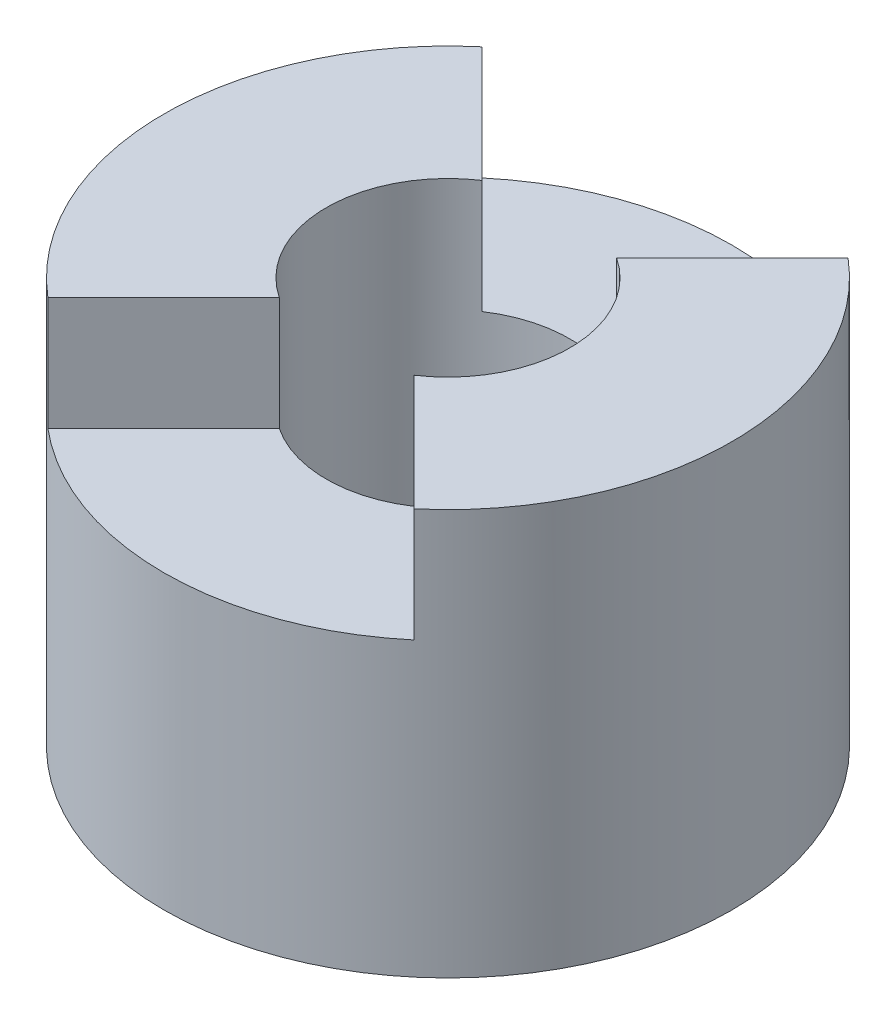
ISO-10303-21;
HEADER;
FILE_DESCRIPTION(('STEP AP214'),'2;1');
FILE_NAME('part.step','',(''),(''),'','','');
FILE_SCHEMA(('AUTOMOTIVE_DESIGN { 1 0 10303 214 1 1 1 1 }'));
ENDSEC;
DATA;
#1=APPLICATION_CONTEXT('core data for automotive mechanical design processes');
#2=APPLICATION_PROTOCOL_DEFINITION('international standard','automotive_design',2000,#1);
#3=PRODUCT_CONTEXT('',#1,'mechanical');
#4=PRODUCT('Part','Part','',(#3));
#5=PRODUCT_RELATED_PRODUCT_CATEGORY('part','',(#4));
#6=PRODUCT_DEFINITION_FORMATION('','',#4);
#7=PRODUCT_DEFINITION_CONTEXT('part definition',#1,'design');
#8=PRODUCT_DEFINITION('design','',#6,#7);
#9=PRODUCT_DEFINITION_SHAPE('','',#8);
#10=(LENGTH_UNIT() NAMED_UNIT(*) SI_UNIT(.MILLI.,.METRE.));
#11=(NAMED_UNIT(*) PLANE_ANGLE_UNIT() SI_UNIT($,.RADIAN.));
#12=(NAMED_UNIT(*) SI_UNIT($,.STERADIAN.) SOLID_ANGLE_UNIT());
#13=UNCERTAINTY_MEASURE_WITH_UNIT(LENGTH_MEASURE(1.E-05),#10,'distance_accuracy_value','');
#14=(GEOMETRIC_REPRESENTATION_CONTEXT(3) GLOBAL_UNCERTAINTY_ASSIGNED_CONTEXT((#13)) GLOBAL_UNIT_ASSIGNED_CONTEXT((#10,
#11,#12)) REPRESENTATION_CONTEXT('',''));
#15=CARTESIAN_POINT('',(0.,0.,0.));
#16=DIRECTION('',(0.,0.,1.));
#17=DIRECTION('',(1.,0.,0.));
#18=AXIS2_PLACEMENT_3D('',#15,#16,#17);
#19=CARTESIAN_POINT('',(0.,50.,0.));
#20=DIRECTION('',(0.,1.,0.));
#21=DIRECTION('',(0.,0.,1.));
#22=AXIS2_PLACEMENT_3D('',#19,#20,#21);
#23=PLANE('',#22);
#24=CARTESIAN_POINT('',(0.,50.,0.));
#25=DIRECTION('',(0.,1.,0.));
#26=DIRECTION('',(0.,0.,1.));
#27=AXIS2_PLACEMENT_3D('',#24,#25,#26);
#28=CIRCLE('',#27,15.);
#29=CARTESIAN_POINT('',(-8.2915619758885,50.,-12.5));
#30=VERTEX_POINT('',#29);
#31=CARTESIAN_POINT('',(-8.2915619758885,50.,12.5));
#32=VERTEX_POINT('',#31);
#33=EDGE_CURVE('E119',#30,#32,#28,.T.);
#34=ORIENTED_EDGE('',*,*,#33,.F.);
#35=DIRECTION('',(-0.707106781186547,0.,-0.707106781186548));
#36=VECTOR('',#35,1.);
#37=CARTESIAN_POINT('',(-8.2915619758885,50.,-12.5));
#38=LINE('',#37,#36);
#39=CARTESIAN_POINT('',(-22.5549022689085,50.,-26.76334029302));
#40=VERTEX_POINT('',#39);
#41=EDGE_CURVE('E107',#30,#40,#38,.T.);
#42=ORIENTED_EDGE('',*,*,#41,.T.);
#43=CARTESIAN_POINT('',(0.,50.,0.));
#44=DIRECTION('',(0.,1.,0.));
#45=DIRECTION('',(0.,0.,1.));
#46=AXIS2_PLACEMENT_3D('',#43,#44,#45);
#47=CIRCLE('',#46,35.);
#48=CARTESIAN_POINT('',(-22.5549022689085,50.,26.76334029302));
#49=VERTEX_POINT('',#48);
#50=EDGE_CURVE('E46',#40,#49,#47,.T.);
#51=ORIENTED_EDGE('',*,*,#50,.T.);
#52=DIRECTION('',(-0.707106781186547,0.,0.707106781186548));
#53=VECTOR('',#52,1.);
#54=CARTESIAN_POINT('',(-8.2915619758885,50.,12.5));
#55=LINE('',#54,#53);
#56=EDGE_CURVE('E138',#32,#49,#55,.T.);
#57=ORIENTED_EDGE('',*,*,#56,.F.);
#58=EDGE_LOOP('',(#34,#42,#51,#57));
#59=FACE_BOUND('',#58,.T.);
#60=ADVANCED_FACE('F37',(#59),#23,.T.);
#61=CARTESIAN_POINT('',(22.5549022689085,50.,26.76334029302));
#62=VERTEX_POINT('',#61);
#63=CARTESIAN_POINT('',(22.5549022689085,50.,-26.76334029302));
#64=VERTEX_POINT('',#63);
#65=EDGE_CURVE('E12',#62,#64,#47,.T.);
#66=ORIENTED_EDGE('',*,*,#65,.T.);
#67=DIRECTION('',(-0.707106781186547,0.,0.707106781186548));
#68=VECTOR('',#67,1.);
#69=CARTESIAN_POINT('',(8.2915619758885,50.,-12.5));
#70=LINE('',#69,#68);
#71=CARTESIAN_POINT('',(8.2915619758885,50.,-12.5));
#72=VERTEX_POINT('',#71);
#73=EDGE_CURVE('E113',#64,#72,#70,.T.);
#74=ORIENTED_EDGE('',*,*,#73,.T.);
#75=CARTESIAN_POINT('',(8.2915619758885,50.,12.5));
#76=VERTEX_POINT('',#75);
#77=EDGE_CURVE('E126',#76,#72,#28,.T.);
#78=ORIENTED_EDGE('',*,*,#77,.F.);
#79=DIRECTION('',(-0.707106781186547,0.,-0.707106781186548));
#80=VECTOR('',#79,1.);
#81=CARTESIAN_POINT('',(8.2915619758885,50.,12.5));
#82=LINE('',#81,#80);
#83=EDGE_CURVE('E147',#62,#76,#82,.T.);
#84=ORIENTED_EDGE('',*,*,#83,.F.);
#85=EDGE_LOOP('',(#66,#74,#78,#84));
#86=FACE_BOUND('',#85,.T.);
#87=ADVANCED_FACE('F178',(#86),#23,.T.);
#88=CARTESIAN_POINT('',(0.,50.,0.));
#89=DIRECTION('',(0.,-1.,0.));
#90=DIRECTION('',(0.,0.,-1.));
#91=AXIS2_PLACEMENT_3D('',#88,#89,#90);
#92=CYLINDRICAL_SURFACE('',#91,35.);
#93=CARTESIAN_POINT('',(0.,0.,0.));
#94=DIRECTION('',(0.,1.,0.));
#95=DIRECTION('',(0.,0.,1.));
#96=AXIS2_PLACEMENT_3D('',#93,#94,#95);
#97=CIRCLE('',#96,35.);
#98=CARTESIAN_POINT('',(0.,0.,35.));
#99=VERTEX_POINT('',#98);
#100=EDGE_CURVE('E41',#99,#99,#97,.T.);
#101=ORIENTED_EDGE('',*,*,#100,.T.);
#102=EDGE_LOOP('',(#101));
#103=FACE_BOUND('',#102,.T.);
#104=DIRECTION('',(0.,1.,0.));
#105=VECTOR('',#104,1.);
#106=CARTESIAN_POINT('',(-22.5549022689085,-50.4097655761267,-26.76334029302));
#107=LINE('',#106,#105);
#108=CARTESIAN_POINT('',(-22.5549022689085,36.,-26.76334029302));
#109=VERTEX_POINT('',#108);
#110=EDGE_CURVE('E104',#109,#40,#107,.T.);
#111=ORIENTED_EDGE('',*,*,#110,.F.);
#112=CARTESIAN_POINT('',(0.,36.,0.));
#113=DIRECTION('',(0.,1.,0.));
#114=DIRECTION('',(0.,0.,1.));
#115=AXIS2_PLACEMENT_3D('',#112,#113,#114);
#116=CIRCLE('',#115,35.);
#117=CARTESIAN_POINT('',(22.5549022689085,36.,-26.76334029302));
#118=VERTEX_POINT('',#117);
#119=EDGE_CURVE('E149',#118,#109,#116,.T.);
#120=ORIENTED_EDGE('',*,*,#119,.F.);
#121=DIRECTION('',(0.,1.,0.));
#122=VECTOR('',#121,1.);
#123=CARTESIAN_POINT('',(22.5549022689085,-50.4097655761267,-26.76334029302));
#124=LINE('',#123,#122);
#125=EDGE_CURVE('E156',#118,#64,#124,.T.);
#126=ORIENTED_EDGE('',*,*,#125,.T.);
#127=ORIENTED_EDGE('',*,*,#65,.F.);
#128=DIRECTION('',(0.,1.,0.));
#129=VECTOR('',#128,1.);
#130=CARTESIAN_POINT('',(22.5549022689085,-50.4097655761267,26.76334029302));
#131=LINE('',#130,#129);
#132=CARTESIAN_POINT('',(22.5549022689085,36.,26.76334029302));
#133=VERTEX_POINT('',#132);
#134=EDGE_CURVE('E135',#133,#62,#131,.T.);
#135=ORIENTED_EDGE('',*,*,#134,.F.);
#136=CARTESIAN_POINT('',(0.,36.,0.));
#137=DIRECTION('',(0.,1.,0.));
#138=DIRECTION('',(0.,0.,1.));
#139=AXIS2_PLACEMENT_3D('',#136,#137,#138);
#140=CIRCLE('',#139,35.);
#141=CARTESIAN_POINT('',(-22.5549022689085,36.,26.76334029302));
#142=VERTEX_POINT('',#141);
#143=EDGE_CURVE('E134',#133,#142,#140,.F.);
#144=ORIENTED_EDGE('',*,*,#143,.T.);
#145=DIRECTION('',(0.,1.,0.));
#146=VECTOR('',#145,1.);
#147=CARTESIAN_POINT('',(-22.5549022689085,-50.4097655761267,26.76334029302));
#148=LINE('',#147,#146);
#149=EDGE_CURVE('E124',#142,#49,#148,.T.);
#150=ORIENTED_EDGE('',*,*,#149,.T.);
#151=ORIENTED_EDGE('',*,*,#50,.F.);
#152=EDGE_LOOP('',(#111,#120,#126,#127,#135,#144,#150,#151));
#153=FACE_BOUND('',#152,.T.);
#154=ADVANCED_FACE('F39',(#103,#153),#92,.T.);
#155=CARTESIAN_POINT('',(0.,50.,0.));
#156=DIRECTION('',(0.,-1.,0.));
#157=DIRECTION('',(0.,0.,-1.));
#158=AXIS2_PLACEMENT_3D('',#155,#156,#157);
#159=CYLINDRICAL_SURFACE('',#158,15.);
#160=CARTESIAN_POINT('',(0.,0.,0.));
#161=DIRECTION('',(0.,1.,0.));
#162=DIRECTION('',(0.,0.,1.));
#163=AXIS2_PLACEMENT_3D('',#160,#161,#162);
#164=CIRCLE('',#163,15.);
#165=CARTESIAN_POINT('',(0.,0.,15.));
#166=VERTEX_POINT('',#165);
#167=EDGE_CURVE('E128',#166,#166,#164,.T.);
#168=ORIENTED_EDGE('',*,*,#167,.F.);
#169=EDGE_LOOP('',(#168));
#170=FACE_BOUND('',#169,.T.);
#171=CARTESIAN_POINT('',(0.,36.,0.));
#172=DIRECTION('',(0.,1.,0.));
#173=DIRECTION('',(0.,0.,1.));
#174=AXIS2_PLACEMENT_3D('',#171,#172,#173);
#175=CIRCLE('',#174,15.);
#176=CARTESIAN_POINT('',(-8.2915619758885,36.,-12.5));
#177=VERTEX_POINT('',#176);
#178=CARTESIAN_POINT('',(8.2915619758885,36.,-12.5));
#179=VERTEX_POINT('',#178);
#180=EDGE_CURVE('E155',#177,#179,#175,.F.);
#181=ORIENTED_EDGE('',*,*,#180,.F.);
#182=DIRECTION('',(0.,1.,0.));
#183=VECTOR('',#182,1.);
#184=CARTESIAN_POINT('',(-8.2915619758885,-50.4097655761267,-12.5));
#185=LINE('',#184,#183);
#186=EDGE_CURVE('E112',#177,#30,#185,.T.);
#187=ORIENTED_EDGE('',*,*,#186,.T.);
#188=ORIENTED_EDGE('',*,*,#33,.T.);
#189=DIRECTION('',(0.,1.,0.));
#190=VECTOR('',#189,1.);
#191=CARTESIAN_POINT('',(-8.2915619758885,-50.4097655761267,12.5));
#192=LINE('',#191,#190);
#193=CARTESIAN_POINT('',(-8.2915619758885,36.,12.5));
#194=VERTEX_POINT('',#193);
#195=EDGE_CURVE('E141',#194,#32,#192,.T.);
#196=ORIENTED_EDGE('',*,*,#195,.F.);
#197=CARTESIAN_POINT('',(0.,36.,0.));
#198=DIRECTION('',(0.,1.,0.));
#199=DIRECTION('',(0.,0.,1.));
#200=AXIS2_PLACEMENT_3D('',#197,#198,#199);
#201=CIRCLE('',#200,15.);
#202=CARTESIAN_POINT('',(8.2915619758885,36.,12.5));
#203=VERTEX_POINT('',#202);
#204=EDGE_CURVE('E145',#194,#203,#201,.T.);
#205=ORIENTED_EDGE('',*,*,#204,.T.);
#206=DIRECTION('',(0.,1.,0.));
#207=VECTOR('',#206,1.);
#208=CARTESIAN_POINT('',(8.2915619758885,-50.4097655761267,12.5));
#209=LINE('',#208,#207);
#210=EDGE_CURVE('E137',#203,#76,#209,.T.);
#211=ORIENTED_EDGE('',*,*,#210,.T.);
#212=ORIENTED_EDGE('',*,*,#77,.T.);
#213=DIRECTION('',(0.,1.,0.));
#214=VECTOR('',#213,1.);
#215=CARTESIAN_POINT('',(8.2915619758885,-50.4097655761267,-12.5));
#216=LINE('',#215,#214);
#217=EDGE_CURVE('E159',#179,#72,#216,.T.);
#218=ORIENTED_EDGE('',*,*,#217,.F.);
#219=EDGE_LOOP('',(#181,#187,#188,#196,#205,#211,#212,#218));
#220=FACE_BOUND('',#219,.T.);
#221=ADVANCED_FACE('F173',(#170,#220),#159,.F.);
#222=CARTESIAN_POINT('',(0.,0.,0.));
#223=DIRECTION('',(0.,1.,0.));
#224=DIRECTION('',(0.,0.,1.));
#225=AXIS2_PLACEMENT_3D('',#222,#223,#224);
#226=PLANE('',#225);
#227=ORIENTED_EDGE('',*,*,#100,.F.);
#228=EDGE_LOOP('',(#227));
#229=FACE_BOUND('',#228,.T.);
#230=ORIENTED_EDGE('',*,*,#167,.T.);
#231=EDGE_LOOP('',(#230));
#232=FACE_BOUND('',#231,.T.);
#233=ADVANCED_FACE('F189',(#229,#232),#226,.F.);
#234=CARTESIAN_POINT('',(-8.2915619758885,-50.4097655761267,12.5));
#235=DIRECTION('',(-0.707106781186548,0.,-0.707106781186547));
#236=DIRECTION('',(-0.707106781186547,0.,0.707106781186548));
#237=AXIS2_PLACEMENT_3D('',#234,#235,#236);
#238=PLANE('',#237);
#239=DIRECTION('',(0.707106781186547,0.,-0.707106781186548));
#240=VECTOR('',#239,1.);
#241=CARTESIAN_POINT('',(-8.2915619758885,36.,12.5));
#242=LINE('',#241,#240);
#243=EDGE_CURVE('E151',#142,#194,#242,.T.);
#244=ORIENTED_EDGE('',*,*,#243,.T.);
#245=ORIENTED_EDGE('',*,*,#195,.T.);
#246=ORIENTED_EDGE('',*,*,#56,.T.);
#247=ORIENTED_EDGE('',*,*,#149,.F.);
#248=EDGE_LOOP('',(#244,#245,#246,#247));
#249=FACE_BOUND('',#248,.T.);
#250=ADVANCED_FACE('F187',(#249),#238,.F.);
#251=CARTESIAN_POINT('',(8.2915619758885,-50.4097655761267,12.5));
#252=DIRECTION('',(0.707106781186548,0.,-0.707106781186547));
#253=DIRECTION('',(-0.707106781186547,0.,-0.707106781186548));
#254=AXIS2_PLACEMENT_3D('',#251,#252,#253);
#255=PLANE('',#254);
#256=DIRECTION('',(0.707106781186547,0.,0.707106781186548));
#257=VECTOR('',#256,1.);
#258=CARTESIAN_POINT('',(8.2915619758885,36.,12.5));
#259=LINE('',#258,#257);
#260=EDGE_CURVE('E61',#203,#133,#259,.T.);
#261=ORIENTED_EDGE('',*,*,#260,.T.);
#262=ORIENTED_EDGE('',*,*,#134,.T.);
#263=ORIENTED_EDGE('',*,*,#83,.T.);
#264=ORIENTED_EDGE('',*,*,#210,.F.);
#265=EDGE_LOOP('',(#261,#262,#263,#264));
#266=FACE_BOUND('',#265,.T.);
#267=ADVANCED_FACE('F183',(#266),#255,.F.);
#268=CARTESIAN_POINT('',(0.,36.,0.));
#269=DIRECTION('',(0.,1.,0.));
#270=DIRECTION('',(0.,0.,1.));
#271=AXIS2_PLACEMENT_3D('',#268,#269,#270);
#272=PLANE('',#271);
#273=ORIENTED_EDGE('',*,*,#143,.F.);
#274=ORIENTED_EDGE('',*,*,#260,.F.);
#275=ORIENTED_EDGE('',*,*,#204,.F.);
#276=ORIENTED_EDGE('',*,*,#243,.F.);
#277=EDGE_LOOP('',(#273,#274,#275,#276));
#278=FACE_BOUND('',#277,.T.);
#279=ADVANCED_FACE('F184',(#278),#272,.T.);
#280=CARTESIAN_POINT('',(-8.2915619758885,-50.4097655761267,-12.5));
#281=DIRECTION('',(0.707106781186548,0.,-0.707106781186547));
#282=DIRECTION('',(-0.707106781186547,0.,-0.707106781186548));
#283=AXIS2_PLACEMENT_3D('',#280,#281,#282);
#284=PLANE('',#283);
#285=ORIENTED_EDGE('',*,*,#110,.T.);
#286=ORIENTED_EDGE('',*,*,#41,.F.);
#287=ORIENTED_EDGE('',*,*,#186,.F.);
#288=DIRECTION('',(0.707106781186547,0.,0.707106781186548));
#289=VECTOR('',#288,1.);
#290=CARTESIAN_POINT('',(-8.2915619758885,36.,-12.5));
#291=LINE('',#290,#289);
#292=EDGE_CURVE('E53',#109,#177,#291,.T.);
#293=ORIENTED_EDGE('',*,*,#292,.F.);
#294=EDGE_LOOP('',(#285,#286,#287,#293));
#295=FACE_BOUND('',#294,.T.);
#296=ADVANCED_FACE('F106',(#295),#284,.T.);
#297=CARTESIAN_POINT('',(8.2915619758885,-50.4097655761267,-12.5));
#298=DIRECTION('',(-0.707106781186548,0.,-0.707106781186547));
#299=DIRECTION('',(-0.707106781186547,0.,0.707106781186548));
#300=AXIS2_PLACEMENT_3D('',#297,#298,#299);
#301=PLANE('',#300);
#302=ORIENTED_EDGE('',*,*,#217,.T.);
#303=ORIENTED_EDGE('',*,*,#73,.F.);
#304=ORIENTED_EDGE('',*,*,#125,.F.);
#305=DIRECTION('',(0.707106781186547,0.,-0.707106781186548));
#306=VECTOR('',#305,1.);
#307=CARTESIAN_POINT('',(8.2915619758885,36.,-12.5));
#308=LINE('',#307,#306);
#309=EDGE_CURVE('E166',#179,#118,#308,.T.);
#310=ORIENTED_EDGE('',*,*,#309,.F.);
#311=EDGE_LOOP('',(#302,#303,#304,#310));
#312=FACE_BOUND('',#311,.T.);
#313=ADVANCED_FACE('F176',(#312),#301,.T.);
#314=CARTESIAN_POINT('',(0.,36.,0.));
#315=DIRECTION('',(0.,1.,0.));
#316=DIRECTION('',(0.,0.,1.));
#317=AXIS2_PLACEMENT_3D('',#314,#315,#316);
#318=PLANE('',#317);
#319=ORIENTED_EDGE('',*,*,#309,.T.);
#320=ORIENTED_EDGE('',*,*,#119,.T.);
#321=ORIENTED_EDGE('',*,*,#292,.T.);
#322=ORIENTED_EDGE('',*,*,#180,.T.);
#323=EDGE_LOOP('',(#319,#320,#321,#322));
#324=FACE_BOUND('',#323,.T.);
#325=ADVANCED_FACE('F171',(#324),#318,.T.);
#326=CLOSED_SHELL('',(#60,#87,#154,#221,#233,#250,#267,#279,#296,#313,#325));
#327=MANIFOLD_SOLID_BREP('B2',#326);
#328=ADVANCED_BREP_SHAPE_REPRESENTATION('',(#18,#327),#14);
#329=SHAPE_DEFINITION_REPRESENTATION(#9,#328);
ENDSEC;
END-ISO-10303-21;
